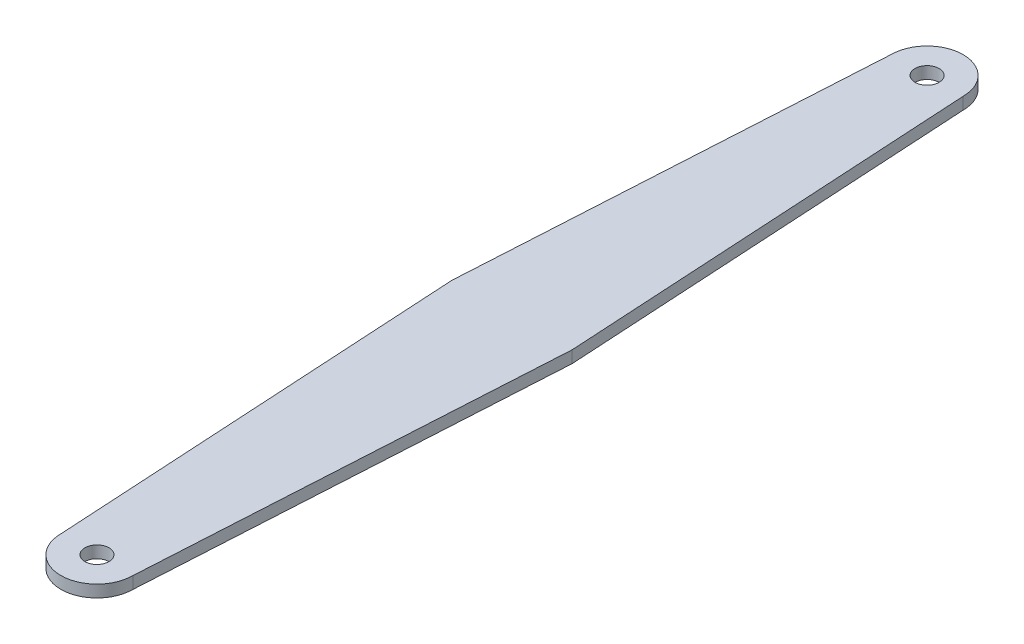
ISO-10303-21;
HEADER;
FILE_DESCRIPTION(('STEP AP214'),'2;1');
FILE_NAME('part.step','',(''),(''),'','','');
FILE_SCHEMA(('AUTOMOTIVE_DESIGN { 1 0 10303 214 1 1 1 1 }'));
ENDSEC;
DATA;
#1=APPLICATION_CONTEXT('core data for automotive mechanical design processes');
#2=APPLICATION_PROTOCOL_DEFINITION('international standard','automotive_design',2000,#1);
#3=PRODUCT_CONTEXT('',#1,'mechanical');
#4=PRODUCT('Part','Part','',(#3));
#5=PRODUCT_RELATED_PRODUCT_CATEGORY('part','',(#4));
#6=PRODUCT_DEFINITION_FORMATION('','',#4);
#7=PRODUCT_DEFINITION_CONTEXT('part definition',#1,'design');
#8=PRODUCT_DEFINITION('design','',#6,#7);
#9=PRODUCT_DEFINITION_SHAPE('','',#8);
#10=(LENGTH_UNIT() NAMED_UNIT(*) SI_UNIT(.MILLI.,.METRE.));
#11=(NAMED_UNIT(*) PLANE_ANGLE_UNIT() SI_UNIT($,.RADIAN.));
#12=(NAMED_UNIT(*) SI_UNIT($,.STERADIAN.) SOLID_ANGLE_UNIT());
#13=UNCERTAINTY_MEASURE_WITH_UNIT(LENGTH_MEASURE(1.E-05),#10,'distance_accuracy_value','');
#14=(GEOMETRIC_REPRESENTATION_CONTEXT(3) GLOBAL_UNCERTAINTY_ASSIGNED_CONTEXT((#13)) GLOBAL_UNIT_ASSIGNED_CONTEXT((#10,
#11,#12)) REPRESENTATION_CONTEXT('',''));
#15=CARTESIAN_POINT('',(0.,0.,0.));
#16=DIRECTION('',(0.,0.,1.));
#17=DIRECTION('',(1.,0.,0.));
#18=AXIS2_PLACEMENT_3D('',#15,#16,#17);
#19=CARTESIAN_POINT('',(50.,10.,-345.));
#20=DIRECTION('',(0.,-1.,0.));
#21=DIRECTION('',(0.,0.,-1.));
#22=AXIS2_PLACEMENT_3D('',#19,#20,#21);
#23=CYLINDRICAL_SURFACE('',#22,30.);
#24=CARTESIAN_POINT('',(50.,0.,-345.));
#25=DIRECTION('',(0.,1.,0.));
#26=DIRECTION('',(0.,0.,-1.));
#27=AXIS2_PLACEMENT_3D('',#24,#25,#26);
#28=CIRCLE('',#27,30.);
#29=CARTESIAN_POINT('',(80.,0.,-345.));
#30=VERTEX_POINT('',#29);
#31=CARTESIAN_POINT('',(20.,0.,-345.));
#32=VERTEX_POINT('',#31);
#33=EDGE_CURVE('E117',#30,#32,#28,.T.);
#34=ORIENTED_EDGE('',*,*,#33,.T.);
#35=DIRECTION('',(0.,-1.,0.));
#36=VECTOR('',#35,1.);
#37=CARTESIAN_POINT('',(20.,10.,-345.));
#38=LINE('',#37,#36);
#39=CARTESIAN_POINT('',(20.,10.,-345.));
#40=VERTEX_POINT('',#39);
#41=EDGE_CURVE('E11',#40,#32,#38,.T.);
#42=ORIENTED_EDGE('',*,*,#41,.F.);
#43=CARTESIAN_POINT('',(50.,10.,-345.));
#44=DIRECTION('',(0.,1.,0.));
#45=DIRECTION('',(0.,0.,-1.));
#46=AXIS2_PLACEMENT_3D('',#43,#44,#45);
#47=CIRCLE('',#46,30.);
#48=CARTESIAN_POINT('',(80.,10.,-345.));
#49=VERTEX_POINT('',#48);
#50=EDGE_CURVE('E128',#49,#40,#47,.T.);
#51=ORIENTED_EDGE('',*,*,#50,.F.);
#52=DIRECTION('',(0.,-1.,0.));
#53=VECTOR('',#52,1.);
#54=CARTESIAN_POINT('',(80.,10.,-345.));
#55=LINE('',#54,#53);
#56=EDGE_CURVE('E113',#49,#30,#55,.T.);
#57=ORIENTED_EDGE('',*,*,#56,.T.);
#58=EDGE_LOOP('',(#34,#42,#51,#57));
#59=FACE_BOUND('',#58,.T.);
#60=ADVANCED_FACE('F33',(#59),#23,.T.);
#61=CARTESIAN_POINT('',(20.,10.,-345.));
#62=DIRECTION('',(0.9983239041225,0.,0.0578738495143479));
#63=DIRECTION('',(0.0578738495143479,0.,-0.9983239041225));
#64=AXIS2_PLACEMENT_3D('',#61,#62,#63);
#65=PLANE('',#64);
#66=DIRECTION('',(-0.0578738495143479,0.,0.9983239041225));
#67=VECTOR('',#66,1.);
#68=CARTESIAN_POINT('',(20.,0.,-345.));
#69=LINE('',#68,#67);
#70=CARTESIAN_POINT('',(0.,0.,0.));
#71=VERTEX_POINT('',#70);
#72=EDGE_CURVE('E120',#32,#71,#69,.T.);
#73=ORIENTED_EDGE('',*,*,#72,.T.);
#74=DIRECTION('',(0.,-1.,0.));
#75=VECTOR('',#74,1.);
#76=CARTESIAN_POINT('',(0.,10.,0.));
#77=LINE('',#76,#75);
#78=CARTESIAN_POINT('',(0.,10.,0.));
#79=VERTEX_POINT('',#78);
#80=EDGE_CURVE('E41',#79,#71,#77,.T.);
#81=ORIENTED_EDGE('',*,*,#80,.F.);
#82=DIRECTION('',(-0.0578738495143479,0.,0.9983239041225));
#83=VECTOR('',#82,1.);
#84=CARTESIAN_POINT('',(20.,10.,-345.));
#85=LINE('',#84,#83);
#86=EDGE_CURVE('E86',#40,#79,#85,.T.);
#87=ORIENTED_EDGE('',*,*,#86,.F.);
#88=ORIENTED_EDGE('',*,*,#41,.T.);
#89=EDGE_LOOP('',(#73,#81,#87,#88));
#90=FACE_BOUND('',#89,.T.);
#91=ADVANCED_FACE('F153',(#90),#65,.F.);
#92=CARTESIAN_POINT('',(0.,10.,0.));
#93=DIRECTION('',(0.9983239041225,0.,-0.0578738495143478));
#94=DIRECTION('',(-0.0578738495143478,0.,-0.9983239041225));
#95=AXIS2_PLACEMENT_3D('',#92,#93,#94);
#96=PLANE('',#95);
#97=DIRECTION('',(0.0578738495143478,0.,0.9983239041225));
#98=VECTOR('',#97,1.);
#99=CARTESIAN_POINT('',(0.,0.,0.));
#100=LINE('',#99,#98);
#101=CARTESIAN_POINT('',(20.,0.,345.));
#102=VERTEX_POINT('',#101);
#103=EDGE_CURVE('E123',#71,#102,#100,.T.);
#104=ORIENTED_EDGE('',*,*,#103,.T.);
#105=DIRECTION('',(0.,-1.,0.));
#106=VECTOR('',#105,1.);
#107=CARTESIAN_POINT('',(20.,10.,345.));
#108=LINE('',#107,#106);
#109=CARTESIAN_POINT('',(20.,10.,345.));
#110=VERTEX_POINT('',#109);
#111=EDGE_CURVE('E108',#110,#102,#108,.T.);
#112=ORIENTED_EDGE('',*,*,#111,.F.);
#113=DIRECTION('',(0.0578738495143478,0.,0.9983239041225));
#114=VECTOR('',#113,1.);
#115=CARTESIAN_POINT('',(0.,10.,0.));
#116=LINE('',#115,#114);
#117=EDGE_CURVE('E99',#79,#110,#116,.T.);
#118=ORIENTED_EDGE('',*,*,#117,.F.);
#119=ORIENTED_EDGE('',*,*,#80,.T.);
#120=EDGE_LOOP('',(#104,#112,#118,#119));
#121=FACE_BOUND('',#120,.T.);
#122=ADVANCED_FACE('F134',(#121),#96,.F.);
#123=CARTESIAN_POINT('',(50.,10.,345.));
#124=DIRECTION('',(0.,-1.,0.));
#125=DIRECTION('',(0.,0.,-1.));
#126=AXIS2_PLACEMENT_3D('',#123,#124,#125);
#127=CYLINDRICAL_SURFACE('',#126,30.);
#128=CARTESIAN_POINT('',(50.,0.,345.));
#129=DIRECTION('',(0.,1.,0.));
#130=DIRECTION('',(0.,0.,1.));
#131=AXIS2_PLACEMENT_3D('',#128,#129,#130);
#132=CIRCLE('',#131,30.);
#133=CARTESIAN_POINT('',(80.,0.,345.));
#134=VERTEX_POINT('',#133);
#135=EDGE_CURVE('E107',#102,#134,#132,.T.);
#136=ORIENTED_EDGE('',*,*,#135,.T.);
#137=DIRECTION('',(0.,-1.,0.));
#138=VECTOR('',#137,1.);
#139=CARTESIAN_POINT('',(80.,10.,345.));
#140=LINE('',#139,#138);
#141=CARTESIAN_POINT('',(80.,10.,345.));
#142=VERTEX_POINT('',#141);
#143=EDGE_CURVE('E104',#142,#134,#140,.T.);
#144=ORIENTED_EDGE('',*,*,#143,.F.);
#145=CARTESIAN_POINT('',(50.,10.,345.));
#146=DIRECTION('',(0.,1.,0.));
#147=DIRECTION('',(0.,0.,1.));
#148=AXIS2_PLACEMENT_3D('',#145,#146,#147);
#149=CIRCLE('',#148,30.);
#150=EDGE_CURVE('E93',#110,#142,#149,.T.);
#151=ORIENTED_EDGE('',*,*,#150,.F.);
#152=ORIENTED_EDGE('',*,*,#111,.T.);
#153=EDGE_LOOP('',(#136,#144,#151,#152));
#154=FACE_BOUND('',#153,.T.);
#155=ADVANCED_FACE('F105',(#154),#127,.T.);
#156=CARTESIAN_POINT('',(80.,10.,345.));
#157=DIRECTION('',(-0.9983239041225,0.,-0.0578738495143478));
#158=DIRECTION('',(-0.0578738495143478,0.,0.9983239041225));
#159=AXIS2_PLACEMENT_3D('',#156,#157,#158);
#160=PLANE('',#159);
#161=DIRECTION('',(0.0578738495143478,0.,-0.9983239041225));
#162=VECTOR('',#161,1.);
#163=CARTESIAN_POINT('',(80.,0.,345.));
#164=LINE('',#163,#162);
#165=CARTESIAN_POINT('',(100.,0.,0.));
#166=VERTEX_POINT('',#165);
#167=EDGE_CURVE('E72',#134,#166,#164,.T.);
#168=ORIENTED_EDGE('',*,*,#167,.T.);
#169=DIRECTION('',(0.,-1.,0.));
#170=VECTOR('',#169,1.);
#171=CARTESIAN_POINT('',(100.,10.,0.));
#172=LINE('',#171,#170);
#173=CARTESIAN_POINT('',(100.,10.,0.));
#174=VERTEX_POINT('',#173);
#175=EDGE_CURVE('E109',#174,#166,#172,.T.);
#176=ORIENTED_EDGE('',*,*,#175,.F.);
#177=DIRECTION('',(0.0578738495143478,0.,-0.9983239041225));
#178=VECTOR('',#177,1.);
#179=CARTESIAN_POINT('',(80.,10.,345.));
#180=LINE('',#179,#178);
#181=EDGE_CURVE('E97',#142,#174,#180,.T.);
#182=ORIENTED_EDGE('',*,*,#181,.F.);
#183=ORIENTED_EDGE('',*,*,#143,.T.);
#184=EDGE_LOOP('',(#168,#176,#182,#183));
#185=FACE_BOUND('',#184,.T.);
#186=ADVANCED_FACE('F111',(#185),#160,.F.);
#187=CARTESIAN_POINT('',(100.,10.,0.));
#188=DIRECTION('',(-0.9983239041225,0.,0.0578738495143478));
#189=DIRECTION('',(0.0578738495143478,0.,0.9983239041225));
#190=AXIS2_PLACEMENT_3D('',#187,#188,#189);
#191=PLANE('',#190);
#192=DIRECTION('',(-0.0578738495143478,0.,-0.9983239041225));
#193=VECTOR('',#192,1.);
#194=CARTESIAN_POINT('',(100.,0.,0.));
#195=LINE('',#194,#193);
#196=EDGE_CURVE('E78',#166,#30,#195,.T.);
#197=ORIENTED_EDGE('',*,*,#196,.T.);
#198=ORIENTED_EDGE('',*,*,#56,.F.);
#199=DIRECTION('',(-0.0578738495143478,0.,-0.9983239041225));
#200=VECTOR('',#199,1.);
#201=CARTESIAN_POINT('',(100.,10.,0.));
#202=LINE('',#201,#200);
#203=EDGE_CURVE('E49',#174,#49,#202,.T.);
#204=ORIENTED_EDGE('',*,*,#203,.F.);
#205=ORIENTED_EDGE('',*,*,#175,.T.);
#206=EDGE_LOOP('',(#197,#198,#204,#205));
#207=FACE_BOUND('',#206,.T.);
#208=ADVANCED_FACE('F141',(#207),#191,.F.);
#209=CARTESIAN_POINT('',(50.,10.,-345.));
#210=DIRECTION('',(0.,-1.,0.));
#211=DIRECTION('',(0.,0.,-1.));
#212=AXIS2_PLACEMENT_3D('',#209,#210,#211);
#213=PLANE('',#212);
#214=CARTESIAN_POINT('',(50.,10.,-345.));
#215=DIRECTION('',(0.,1.,0.));
#216=DIRECTION('',(0.,0.,-1.));
#217=AXIS2_PLACEMENT_3D('',#214,#215,#216);
#218=CIRCLE('',#217,10.);
#219=CARTESIAN_POINT('',(50.,10.,-355.));
#220=VERTEX_POINT('',#219);
#221=EDGE_CURVE('E219',#220,#220,#218,.T.);
#222=ORIENTED_EDGE('',*,*,#221,.F.);
#223=EDGE_LOOP('',(#222));
#224=FACE_BOUND('',#223,.T.);
#225=CARTESIAN_POINT('',(50.,10.,345.));
#226=DIRECTION('',(0.,1.,0.));
#227=DIRECTION('',(0.,0.,1.));
#228=AXIS2_PLACEMENT_3D('',#225,#226,#227);
#229=CIRCLE('',#228,10.);
#230=CARTESIAN_POINT('',(50.,10.,355.));
#231=VERTEX_POINT('',#230);
#232=EDGE_CURVE('E221',#231,#231,#229,.T.);
#233=ORIENTED_EDGE('',*,*,#232,.F.);
#234=EDGE_LOOP('',(#233));
#235=FACE_BOUND('',#234,.T.);
#236=ORIENTED_EDGE('',*,*,#50,.T.);
#237=ORIENTED_EDGE('',*,*,#86,.T.);
#238=ORIENTED_EDGE('',*,*,#117,.T.);
#239=ORIENTED_EDGE('',*,*,#150,.T.);
#240=ORIENTED_EDGE('',*,*,#181,.T.);
#241=ORIENTED_EDGE('',*,*,#203,.T.);
#242=EDGE_LOOP('',(#236,#237,#238,#239,#240,#241));
#243=FACE_BOUND('',#242,.T.);
#244=ADVANCED_FACE('F95',(#224,#235,#243),#213,.F.);
#245=CARTESIAN_POINT('',(50.,0.,-345.));
#246=DIRECTION('',(0.,-1.,0.));
#247=DIRECTION('',(0.,0.,-1.));
#248=AXIS2_PLACEMENT_3D('',#245,#246,#247);
#249=PLANE('',#248);
#250=CARTESIAN_POINT('',(50.,0.,-345.));
#251=DIRECTION('',(0.,1.,0.));
#252=DIRECTION('',(0.,0.,-1.));
#253=AXIS2_PLACEMENT_3D('',#250,#251,#252);
#254=CIRCLE('',#253,10.);
#255=CARTESIAN_POINT('',(50.,0.,-355.));
#256=VERTEX_POINT('',#255);
#257=EDGE_CURVE('E216',#256,#256,#254,.T.);
#258=ORIENTED_EDGE('',*,*,#257,.T.);
#259=EDGE_LOOP('',(#258));
#260=FACE_BOUND('',#259,.T.);
#261=CARTESIAN_POINT('',(50.,0.,345.));
#262=DIRECTION('',(0.,1.,0.));
#263=DIRECTION('',(0.,0.,1.));
#264=AXIS2_PLACEMENT_3D('',#261,#262,#263);
#265=CIRCLE('',#264,10.);
#266=CARTESIAN_POINT('',(50.,0.,355.));
#267=VERTEX_POINT('',#266);
#268=EDGE_CURVE('E121',#267,#267,#265,.T.);
#269=ORIENTED_EDGE('',*,*,#268,.T.);
#270=EDGE_LOOP('',(#269));
#271=FACE_BOUND('',#270,.T.);
#272=ORIENTED_EDGE('',*,*,#33,.F.);
#273=ORIENTED_EDGE('',*,*,#196,.F.);
#274=ORIENTED_EDGE('',*,*,#167,.F.);
#275=ORIENTED_EDGE('',*,*,#135,.F.);
#276=ORIENTED_EDGE('',*,*,#103,.F.);
#277=ORIENTED_EDGE('',*,*,#72,.F.);
#278=EDGE_LOOP('',(#272,#273,#274,#275,#276,#277));
#279=FACE_BOUND('',#278,.T.);
#280=ADVANCED_FACE('F137',(#260,#271,#279),#249,.T.);
#281=CARTESIAN_POINT('',(50.,0.,345.));
#282=DIRECTION('',(0.,1.,0.));
#283=DIRECTION('',(0.,0.,1.));
#284=AXIS2_PLACEMENT_3D('',#281,#282,#283);
#285=CYLINDRICAL_SURFACE('',#284,10.);
#286=ORIENTED_EDGE('',*,*,#268,.F.);
#287=EDGE_LOOP('',(#286));
#288=FACE_BOUND('',#287,.T.);
#289=ORIENTED_EDGE('',*,*,#232,.T.);
#290=EDGE_LOOP('',(#289));
#291=FACE_BOUND('',#290,.T.);
#292=ADVANCED_FACE('F190',(#288,#291),#285,.F.);
#293=CARTESIAN_POINT('',(50.,0.,-345.));
#294=DIRECTION('',(0.,1.,0.));
#295=DIRECTION('',(0.,0.,1.));
#296=AXIS2_PLACEMENT_3D('',#293,#294,#295);
#297=CYLINDRICAL_SURFACE('',#296,10.);
#298=ORIENTED_EDGE('',*,*,#257,.F.);
#299=EDGE_LOOP('',(#298));
#300=FACE_BOUND('',#299,.T.);
#301=ORIENTED_EDGE('',*,*,#221,.T.);
#302=EDGE_LOOP('',(#301));
#303=FACE_BOUND('',#302,.T.);
#304=ADVANCED_FACE('F199',(#300,#303),#297,.F.);
#305=CLOSED_SHELL('',(#60,#91,#122,#155,#186,#208,#244,#280,#292,#304));
#306=MANIFOLD_SOLID_BREP('B2',#305);
#307=ADVANCED_BREP_SHAPE_REPRESENTATION('',(#18,#306),#14);
#308=SHAPE_DEFINITION_REPRESENTATION(#9,#307);
ENDSEC;
END-ISO-10303-21;
